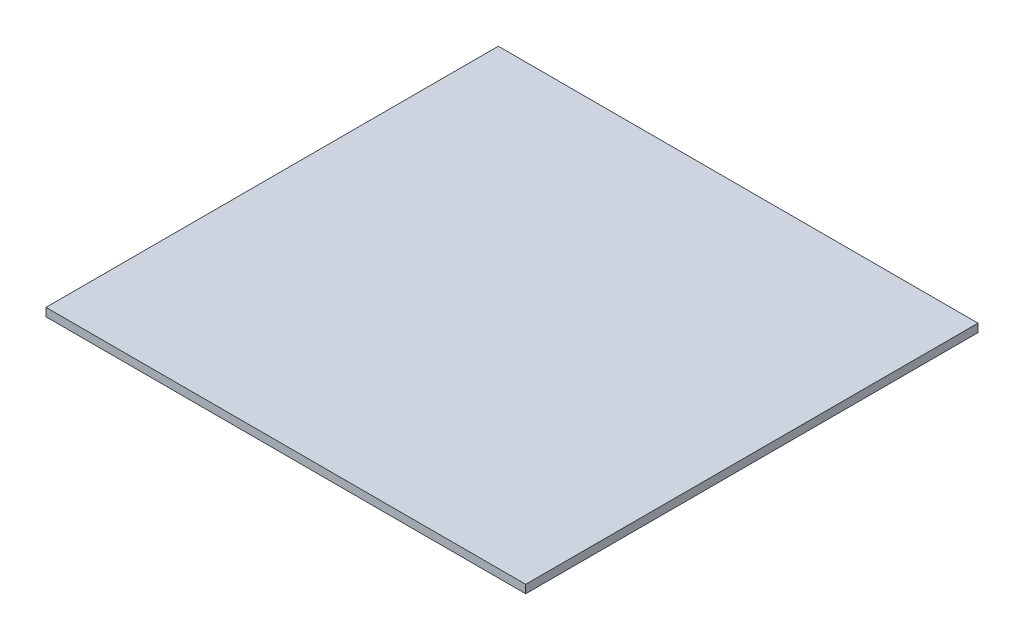
ISO-10303-21;
HEADER;
FILE_DESCRIPTION(('STEP AP214'),'2;1');
FILE_NAME('part.step','',(''),(''),'','','');
FILE_SCHEMA(('AUTOMOTIVE_DESIGN { 1 0 10303 214 1 1 1 1 }'));
ENDSEC;
DATA;
#1=APPLICATION_CONTEXT('core data for automotive mechanical design processes');
#2=APPLICATION_PROTOCOL_DEFINITION('international standard','automotive_design',2000,#1);
#3=PRODUCT_CONTEXT('',#1,'mechanical');
#4=PRODUCT('Part','Part','',(#3));
#5=PRODUCT_RELATED_PRODUCT_CATEGORY('part','',(#4));
#6=PRODUCT_DEFINITION_FORMATION('','',#4);
#7=PRODUCT_DEFINITION_CONTEXT('part definition',#1,'design');
#8=PRODUCT_DEFINITION('design','',#6,#7);
#9=PRODUCT_DEFINITION_SHAPE('','',#8);
#10=(LENGTH_UNIT() NAMED_UNIT(*) SI_UNIT(.MILLI.,.METRE.));
#11=(NAMED_UNIT(*) PLANE_ANGLE_UNIT() SI_UNIT($,.RADIAN.));
#12=(NAMED_UNIT(*) SI_UNIT($,.STERADIAN.) SOLID_ANGLE_UNIT());
#13=UNCERTAINTY_MEASURE_WITH_UNIT(LENGTH_MEASURE(1.E-05),#10,'distance_accuracy_value','');
#14=(GEOMETRIC_REPRESENTATION_CONTEXT(3) GLOBAL_UNCERTAINTY_ASSIGNED_CONTEXT((#13)) GLOBAL_UNIT_ASSIGNED_CONTEXT((#10,
#11,#12)) REPRESENTATION_CONTEXT('',''));
#15=CARTESIAN_POINT('',(0.,0.,0.));
#16=DIRECTION('',(0.,0.,1.));
#17=DIRECTION('',(1.,0.,0.));
#18=AXIS2_PLACEMENT_3D('',#15,#16,#17);
#19=CARTESIAN_POINT('',(0.,6.,0.));
#20=DIRECTION('',(-1.,0.,0.));
#21=DIRECTION('',(0.,0.,1.));
#22=AXIS2_PLACEMENT_3D('',#19,#20,#21);
#23=PLANE('',#22);
#24=DIRECTION('',(0.,0.,-1.));
#25=VECTOR('',#24,1.);
#26=CARTESIAN_POINT('',(0.,0.,0.));
#27=LINE('',#26,#25);
#28=CARTESIAN_POINT('',(0.,0.,0.));
#29=VERTEX_POINT('',#28);
#30=CARTESIAN_POINT('',(0.,0.,-330.));
#31=VERTEX_POINT('',#30);
#32=EDGE_CURVE('E96',#29,#31,#27,.T.);
#33=ORIENTED_EDGE('',*,*,#32,.T.);
#34=DIRECTION('',(0.,-1.,0.));
#35=VECTOR('',#34,1.);
#36=CARTESIAN_POINT('',(0.,6.,-330.));
#37=LINE('',#36,#35);
#38=CARTESIAN_POINT('',(0.,6.,-330.));
#39=VERTEX_POINT('',#38);
#40=EDGE_CURVE('E11',#39,#31,#37,.T.);
#41=ORIENTED_EDGE('',*,*,#40,.F.);
#42=DIRECTION('',(0.,0.,-1.));
#43=VECTOR('',#42,1.);
#44=CARTESIAN_POINT('',(0.,6.,0.));
#45=LINE('',#44,#43);
#46=CARTESIAN_POINT('',(0.,6.,0.));
#47=VERTEX_POINT('',#46);
#48=EDGE_CURVE('E84',#47,#39,#45,.T.);
#49=ORIENTED_EDGE('',*,*,#48,.F.);
#50=DIRECTION('',(0.,-1.,0.));
#51=VECTOR('',#50,1.);
#52=CARTESIAN_POINT('',(0.,6.,0.));
#53=LINE('',#52,#51);
#54=EDGE_CURVE('E92',#47,#29,#53,.T.);
#55=ORIENTED_EDGE('',*,*,#54,.T.);
#56=EDGE_LOOP('',(#33,#41,#49,#55));
#57=FACE_BOUND('',#56,.T.);
#58=ADVANCED_FACE('F33',(#57),#23,.F.);
#59=CARTESIAN_POINT('',(0.,6.,-330.));
#60=DIRECTION('',(0.,0.,1.));
#61=DIRECTION('',(1.,0.,0.));
#62=AXIS2_PLACEMENT_3D('',#59,#60,#61);
#63=PLANE('',#62);
#64=DIRECTION('',(-1.,0.,0.));
#65=VECTOR('',#64,1.);
#66=CARTESIAN_POINT('',(0.,0.,-330.));
#67=LINE('',#66,#65);
#68=CARTESIAN_POINT('',(-350.,0.,-330.));
#69=VERTEX_POINT('',#68);
#70=EDGE_CURVE('E88',#31,#69,#67,.T.);
#71=ORIENTED_EDGE('',*,*,#70,.T.);
#72=DIRECTION('',(0.,-1.,0.));
#73=VECTOR('',#72,1.);
#74=CARTESIAN_POINT('',(-350.,6.,-330.));
#75=LINE('',#74,#73);
#76=CARTESIAN_POINT('',(-350.,6.,-330.));
#77=VERTEX_POINT('',#76);
#78=EDGE_CURVE('E41',#77,#69,#75,.T.);
#79=ORIENTED_EDGE('',*,*,#78,.F.);
#80=DIRECTION('',(-1.,0.,0.));
#81=VECTOR('',#80,1.);
#82=CARTESIAN_POINT('',(0.,6.,-330.));
#83=LINE('',#82,#81);
#84=EDGE_CURVE('E79',#39,#77,#83,.T.);
#85=ORIENTED_EDGE('',*,*,#84,.F.);
#86=ORIENTED_EDGE('',*,*,#40,.T.);
#87=EDGE_LOOP('',(#71,#79,#85,#86));
#88=FACE_BOUND('',#87,.T.);
#89=ADVANCED_FACE('F87',(#88),#63,.F.);
#90=CARTESIAN_POINT('',(-350.,6.,0.));
#91=DIRECTION('',(1.,0.,0.));
#92=DIRECTION('',(0.,0.,-1.));
#93=AXIS2_PLACEMENT_3D('',#90,#91,#92);
#94=PLANE('',#93);
#95=DIRECTION('',(0.,0.,1.));
#96=VECTOR('',#95,1.);
#97=CARTESIAN_POINT('',(-350.,0.,0.));
#98=LINE('',#97,#96);
#99=CARTESIAN_POINT('',(-350.,0.,0.));
#100=VERTEX_POINT('',#99);
#101=EDGE_CURVE('E66',#69,#100,#98,.T.);
#102=ORIENTED_EDGE('',*,*,#101,.T.);
#103=DIRECTION('',(0.,-1.,0.));
#104=VECTOR('',#103,1.);
#105=CARTESIAN_POINT('',(-350.,6.,0.));
#106=LINE('',#105,#104);
#107=CARTESIAN_POINT('',(-350.,6.,0.));
#108=VERTEX_POINT('',#107);
#109=EDGE_CURVE('E89',#108,#100,#106,.T.);
#110=ORIENTED_EDGE('',*,*,#109,.F.);
#111=DIRECTION('',(0.,0.,1.));
#112=VECTOR('',#111,1.);
#113=CARTESIAN_POINT('',(-350.,6.,0.));
#114=LINE('',#113,#112);
#115=EDGE_CURVE('E82',#77,#108,#114,.T.);
#116=ORIENTED_EDGE('',*,*,#115,.F.);
#117=ORIENTED_EDGE('',*,*,#78,.T.);
#118=EDGE_LOOP('',(#102,#110,#116,#117));
#119=FACE_BOUND('',#118,.T.);
#120=ADVANCED_FACE('F90',(#119),#94,.F.);
#121=CARTESIAN_POINT('',(0.,6.,0.));
#122=DIRECTION('',(0.,0.,-1.));
#123=DIRECTION('',(-1.,0.,0.));
#124=AXIS2_PLACEMENT_3D('',#121,#122,#123);
#125=PLANE('',#124);
#126=DIRECTION('',(1.,0.,0.));
#127=VECTOR('',#126,1.);
#128=CARTESIAN_POINT('',(0.,0.,0.));
#129=LINE('',#128,#127);
#130=EDGE_CURVE('E72',#100,#29,#129,.T.);
#131=ORIENTED_EDGE('',*,*,#130,.T.);
#132=ORIENTED_EDGE('',*,*,#54,.F.);
#133=DIRECTION('',(1.,0.,0.));
#134=VECTOR('',#133,1.);
#135=CARTESIAN_POINT('',(0.,6.,0.));
#136=LINE('',#135,#134);
#137=EDGE_CURVE('E49',#108,#47,#136,.T.);
#138=ORIENTED_EDGE('',*,*,#137,.F.);
#139=ORIENTED_EDGE('',*,*,#109,.T.);
#140=EDGE_LOOP('',(#131,#132,#138,#139));
#141=FACE_BOUND('',#140,.T.);
#142=ADVANCED_FACE('F103',(#141),#125,.F.);
#143=CARTESIAN_POINT('',(0.,6.,0.));
#144=DIRECTION('',(0.,1.,0.));
#145=DIRECTION('',(0.,0.,1.));
#146=AXIS2_PLACEMENT_3D('',#143,#144,#145);
#147=PLANE('',#146);
#148=ORIENTED_EDGE('',*,*,#48,.T.);
#149=ORIENTED_EDGE('',*,*,#84,.T.);
#150=ORIENTED_EDGE('',*,*,#115,.T.);
#151=ORIENTED_EDGE('',*,*,#137,.T.);
#152=EDGE_LOOP('',(#148,#149,#150,#151));
#153=FACE_BOUND('',#152,.T.);
#154=ADVANCED_FACE('F80',(#153),#147,.T.);
#155=CARTESIAN_POINT('',(0.,0.,0.));
#156=DIRECTION('',(0.,1.,0.));
#157=DIRECTION('',(0.,0.,1.));
#158=AXIS2_PLACEMENT_3D('',#155,#156,#157);
#159=PLANE('',#158);
#160=ORIENTED_EDGE('',*,*,#32,.F.);
#161=ORIENTED_EDGE('',*,*,#130,.F.);
#162=ORIENTED_EDGE('',*,*,#101,.F.);
#163=ORIENTED_EDGE('',*,*,#70,.F.);
#164=EDGE_LOOP('',(#160,#161,#162,#163));
#165=FACE_BOUND('',#164,.T.);
#166=ADVANCED_FACE('F106',(#165),#159,.F.);
#167=CLOSED_SHELL('',(#58,#89,#120,#142,#154,#166));
#168=MANIFOLD_SOLID_BREP('B2',#167);
#169=ADVANCED_BREP_SHAPE_REPRESENTATION('',(#18,#168),#14);
#170=SHAPE_DEFINITION_REPRESENTATION(#9,#169);
ENDSEC;
END-ISO-10303-21;
